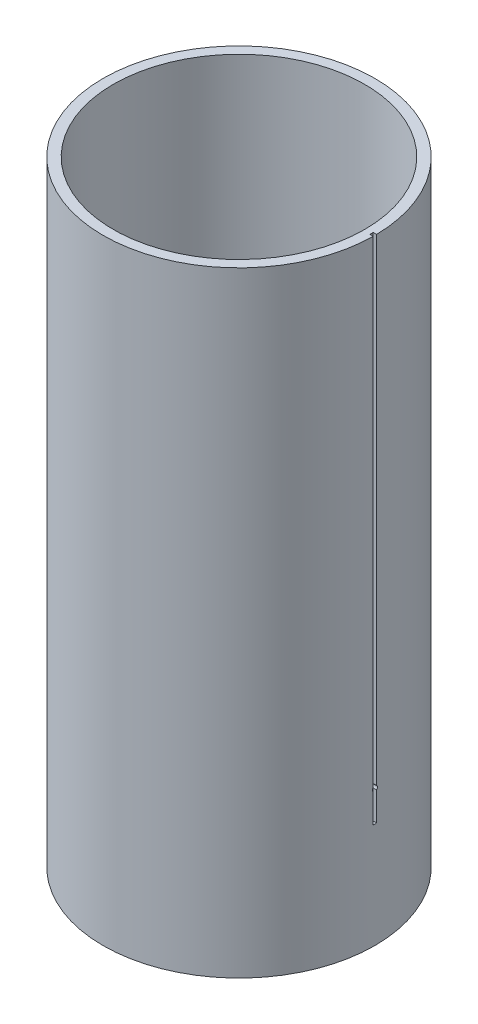
ISO-10303-21;
HEADER;
FILE_DESCRIPTION(('STEP AP214'),'2;1');
FILE_NAME('part.step','',(''),(''),'','','');
FILE_SCHEMA(('AUTOMOTIVE_DESIGN { 1 0 10303 214 1 1 1 1 }'));
ENDSEC;
DATA;
#1=APPLICATION_CONTEXT('core data for automotive mechanical design processes');
#2=APPLICATION_PROTOCOL_DEFINITION('international standard','automotive_design',2000,#1);
#3=PRODUCT_CONTEXT('',#1,'mechanical');
#4=PRODUCT('Part','Part','',(#3));
#5=PRODUCT_RELATED_PRODUCT_CATEGORY('part','',(#4));
#6=PRODUCT_DEFINITION_FORMATION('','',#4);
#7=PRODUCT_DEFINITION_CONTEXT('part definition',#1,'design');
#8=PRODUCT_DEFINITION('design','',#6,#7);
#9=PRODUCT_DEFINITION_SHAPE('','',#8);
#10=(LENGTH_UNIT() NAMED_UNIT(*) SI_UNIT(.MILLI.,.METRE.));
#11=(NAMED_UNIT(*) PLANE_ANGLE_UNIT() SI_UNIT($,.RADIAN.));
#12=(NAMED_UNIT(*) SI_UNIT($,.STERADIAN.) SOLID_ANGLE_UNIT());
#13=UNCERTAINTY_MEASURE_WITH_UNIT(LENGTH_MEASURE(1.E-05),#10,'distance_accuracy_value','');
#14=(GEOMETRIC_REPRESENTATION_CONTEXT(3) GLOBAL_UNCERTAINTY_ASSIGNED_CONTEXT((#13)) GLOBAL_UNIT_ASSIGNED_CONTEXT((#10,
#11,#12)) REPRESENTATION_CONTEXT('',''));
#15=CARTESIAN_POINT('',(0.,0.,0.));
#16=DIRECTION('',(0.,0.,1.));
#17=DIRECTION('',(1.,0.,0.));
#18=AXIS2_PLACEMENT_3D('',#15,#16,#17);
#19=CARTESIAN_POINT('',(38.9999999999999,181.,-0.500000000000012));
#20=DIRECTION('',(-1.,0.,0.));
#21=DIRECTION('',(0.,0.,1.));
#22=AXIS2_PLACEMENT_3D('',#19,#20,#21);
#23=PLANE('',#22);
#24=DIRECTION('',(0.,1.,0.));
#25=VECTOR('',#24,1.);
#26=CARTESIAN_POINT('',(39.,181.,-0.500000000000012));
#27=LINE('',#26,#25);
#28=CARTESIAN_POINT('',(39.,40.559016994375,-0.500000000000011));
#29=VERTEX_POINT('',#28);
#30=CARTESIAN_POINT('',(39.,181.,-0.500000000000012));
#31=VERTEX_POINT('',#30);
#32=EDGE_CURVE('E79',#29,#31,#27,.T.);
#33=ORIENTED_EDGE('',*,*,#32,.T.);
#34=DIRECTION('',(0.,0.,1.));
#35=VECTOR('',#34,1.);
#36=CARTESIAN_POINT('',(38.9999999999999,181.,0.));
#37=LINE('',#36,#35);
#38=CARTESIAN_POINT('',(38.9999999999999,181.,0.499999999999988));
#39=VERTEX_POINT('',#38);
#40=EDGE_CURVE('E132',#39,#31,#37,.F.);
#41=ORIENTED_EDGE('',*,*,#40,.F.);
#42=DIRECTION('',(0.,1.,0.));
#43=VECTOR('',#42,1.);
#44=CARTESIAN_POINT('',(38.9999999999999,181.,0.499999999999988));
#45=LINE('',#44,#43);
#46=CARTESIAN_POINT('',(39.,40.559016994375,0.499999999999988));
#47=VERTEX_POINT('',#46);
#48=EDGE_CURVE('E133',#39,#47,#45,.F.);
#49=ORIENTED_EDGE('',*,*,#48,.T.);
#50=CARTESIAN_POINT('',(39.,40.,0.));
#51=DIRECTION('',(1.,0.,0.));
#52=DIRECTION('',(0.,0.,-1.));
#53=AXIS2_PLACEMENT_3D('',#50,#51,#52);
#54=CIRCLE('',#53,0.75);
#55=EDGE_CURVE('E20',#29,#47,#54,.T.);
#56=ORIENTED_EDGE('',*,*,#55,.F.);
#57=EDGE_LOOP('',(#33,#41,#49,#56));
#58=FACE_BOUND('',#57,.T.);
#59=ADVANCED_FACE('F17',(#58),#23,.F.);
#60=CARTESIAN_POINT('',(38.9999999999999,181.,-0.500000000000012));
#61=DIRECTION('',(-1.,0.,0.));
#62=DIRECTION('',(0.,0.,1.));
#63=AXIS2_PLACEMENT_3D('',#60,#61,#62);
#64=PLANE('',#63);
#65=DIRECTION('',(0.,1.,0.));
#66=VECTOR('',#65,1.);
#67=CARTESIAN_POINT('',(39.,181.,0.499999999999988));
#68=LINE('',#67,#66);
#69=CARTESIAN_POINT('',(39.,39.440983005625,0.499999999999988));
#70=VERTEX_POINT('',#69);
#71=CARTESIAN_POINT('',(39.,31.,0.499999999999988));
#72=VERTEX_POINT('',#71);
#73=EDGE_CURVE('E89',#70,#72,#68,.F.);
#74=ORIENTED_EDGE('',*,*,#73,.T.);
#75=DIRECTION('',(0.,0.,1.));
#76=VECTOR('',#75,1.);
#77=CARTESIAN_POINT('',(39.,31.,0.));
#78=LINE('',#77,#76);
#79=CARTESIAN_POINT('',(39.,31.,-0.500000000000012));
#80=VERTEX_POINT('',#79);
#81=EDGE_CURVE('E91',#80,#72,#78,.T.);
#82=ORIENTED_EDGE('',*,*,#81,.F.);
#83=DIRECTION('',(0.,1.,0.));
#84=VECTOR('',#83,1.);
#85=CARTESIAN_POINT('',(39.,181.,-0.500000000000012));
#86=LINE('',#85,#84);
#87=CARTESIAN_POINT('',(39.,39.4409830056251,-0.500000000000012));
#88=VERTEX_POINT('',#87);
#89=EDGE_CURVE('E118',#80,#88,#86,.T.);
#90=ORIENTED_EDGE('',*,*,#89,.T.);
#91=CARTESIAN_POINT('',(39.,40.,0.));
#92=DIRECTION('',(1.,0.,0.));
#93=DIRECTION('',(0.,0.,-1.));
#94=AXIS2_PLACEMENT_3D('',#91,#92,#93);
#95=CIRCLE('',#94,0.75);
#96=EDGE_CURVE('E94',#88,#70,#95,.F.);
#97=ORIENTED_EDGE('',*,*,#96,.T.);
#98=EDGE_LOOP('',(#74,#82,#90,#97));
#99=FACE_BOUND('',#98,.T.);
#100=ADVANCED_FACE('F90',(#99),#64,.F.);
#101=CARTESIAN_POINT('',(0.,90.5,0.));
#102=DIRECTION('',(0.,-1.,0.));
#103=DIRECTION('',(1.,0.,0.));
#104=AXIS2_PLACEMENT_3D('',#101,#102,#103);
#105=CYLINDRICAL_SURFACE('',#104,37.);
#106=CARTESIAN_POINT('',(0.,0.,0.));
#107=DIRECTION('',(0.,-1.,0.));
#108=DIRECTION('',(1.,0.,0.));
#109=AXIS2_PLACEMENT_3D('',#106,#107,#108);
#110=CIRCLE('',#109,37.);
#111=CARTESIAN_POINT('',(37.,0.,0.));
#112=VERTEX_POINT('',#111);
#113=EDGE_CURVE('E107',#112,#112,#110,.F.);
#114=ORIENTED_EDGE('',*,*,#113,.F.);
#115=EDGE_LOOP('',(#114));
#116=FACE_BOUND('',#115,.T.);
#117=CARTESIAN_POINT('',(36.99239786767,40.,0.75));
#118=CARTESIAN_POINT('',(36.9923979703776,39.9578768140699,0.749998133443684));
#119=CARTESIAN_POINT('',(36.9924705888028,39.9157231949966,0.746439364963934));
#120=CARTESIAN_POINT('',(36.9927532919978,39.8325772080061,0.732292294268633));
#121=CARTESIAN_POINT('',(36.9929635416511,39.7915862945541,0.721695560276461));
#122=CARTESIAN_POINT('',(36.9934976802035,39.7119823072016,0.693774632990046));
#123=CARTESIAN_POINT('',(36.9938215142162,39.6733680954056,0.676453688538889));
#124=CARTESIAN_POINT('',(36.994546261413,39.5996063888738,0.635580571476415));
#125=CARTESIAN_POINT('',(36.994947155584,39.5644580422376,0.612029935373974));
#126=CARTESIAN_POINT('',(36.9957809879328,39.4986048153643,0.559357614178141));
#127=CARTESIAN_POINT('',(36.9962139335548,39.4679009723327,0.530234632346687));
#128=CARTESIAN_POINT('',(36.9970630043643,39.4118169158714,0.46724618952165));
#129=CARTESIAN_POINT('',(36.9974791288864,39.3864369128443,0.433380541182082));
#130=CARTESIAN_POINT('',(36.9982476588202,39.3417207851422,0.361866061335234));
#131=CARTESIAN_POINT('',(36.9986000599341,39.3223850680526,0.324216974924885));
#132=CARTESIAN_POINT('',(36.9992013763344,39.290309125329,0.246206200378215));
#133=CARTESIAN_POINT('',(36.9994502919234,39.2775688804192,0.205844520170134));
#134=CARTESIAN_POINT('',(36.9998165461986,39.2590471715566,0.123560125666501));
#135=CARTESIAN_POINT('',(36.9999339029588,39.2532647517152,0.0816376266173462));
#136=CARTESIAN_POINT('',(37.0000238699803,39.2488198979541,-0.00258319446099518));
#137=CARTESIAN_POINT('',(36.999996480647,39.2501574440922,-0.0448815154372159));
#138=CARTESIAN_POINT('',(36.9998000591075,39.2599137236414,-0.128646795850805));
#139=CARTESIAN_POINT('',(36.9996310476745,39.2683314185248,-0.170113876302631));
#140=CARTESIAN_POINT('',(36.9991704573945,39.2920074455129,-0.251046204426437));
#141=CARTESIAN_POINT('',(36.9988788783542,39.3072657884151,-0.290511448938543));
#142=CARTESIAN_POINT('',(36.9982059854145,39.3441911698019,-0.366323130288698));
#143=CARTESIAN_POINT('',(36.9978246648465,39.3658586845921,-0.402669335072276));
#144=CARTESIAN_POINT('',(36.9970152721113,39.414986979367,-0.471208634047363));
#145=CARTESIAN_POINT('',(36.9965871999056,39.4424477641231,-0.503401724818093));
#146=CARTESIAN_POINT('',(36.995732465833,39.5023889707317,-0.562727012223014));
#147=CARTESIAN_POINT('',(36.9953058042338,39.5348702952342,-0.589858296847963));
#148=CARTESIAN_POINT('',(36.99450207148,39.6039273573199,-0.6382827849312));
#149=CARTESIAN_POINT('',(36.9941250003327,39.6405030954933,-0.659575987547879));
#150=CARTESIAN_POINT('',(36.993462968463,39.7167112168395,-0.695719758675123));
#151=CARTESIAN_POINT('',(36.9931780081406,39.7563436132811,-0.710570299216725));
#152=CARTESIAN_POINT('',(36.9927323444016,39.8375397878188,-0.733406607834691));
#153=CARTESIAN_POINT('',(36.9925716408275,39.8791035634659,-0.741392384615033));
#154=CARTESIAN_POINT('',(36.992392637546,39.9629747077239,-0.750271360209999));
#155=CARTESIAN_POINT('',(36.9923743124949,40.0052819426527,-0.75116582130289));
#156=CARTESIAN_POINT('',(36.9924820662678,40.0894460017049,-0.745840062639382));
#157=CARTESIAN_POINT('',(36.9926081450191,40.1313028260555,-0.739619846469974));
#158=CARTESIAN_POINT('',(36.9929904696356,40.2133743688038,-0.72024234954561));
#159=CARTESIAN_POINT('',(36.9932467047637,40.2535892223595,-0.70708564100959));
#160=CARTESIAN_POINT('',(36.99386044585,40.3312393970862,-0.674209217403048));
#161=CARTESIAN_POINT('',(36.9942179518942,40.3686747158967,-0.65448949675908));
#162=CARTESIAN_POINT('',(36.9949939927155,40.4397089708289,-0.60904357169286));
#163=CARTESIAN_POINT('',(36.9954125361301,40.4733073627789,-0.583316516852368));
#164=CARTESIAN_POINT('',(36.9962634357748,40.5357085587487,-0.526587474537818));
#165=CARTESIAN_POINT('',(36.996695792024,40.5645113561304,-0.495585479762336));
#166=CARTESIAN_POINT('',(36.9975256484875,40.6165079443379,-0.429181199977825));
#167=CARTESIAN_POINT('',(36.9979231436348,40.6397009206574,-0.393778277113606));
#168=CARTESIAN_POINT('',(36.9986383940448,40.6798139140458,-0.319580399148472));
#169=CARTESIAN_POINT('',(36.9989561494354,40.6967339411732,-0.280785449486676));
#170=CARTESIAN_POINT('',(36.9994760742668,40.7238193192323,-0.200907849576696));
#171=CARTESIAN_POINT('',(36.9996782527837,40.7339852005592,-0.159825379239488));
#172=CARTESIAN_POINT('',(36.999944267466,40.7472754582642,-0.0765363364043515));
#173=CARTESIAN_POINT('',(37.0000081035513,40.7503998305589,-0.0343297632545882));
#174=CARTESIAN_POINT('',(36.9999902370405,40.7495183030754,0.0500011528485013));
#175=CARTESIAN_POINT('',(36.9999085607766,40.7455136933724,0.0921255092989919));
#176=CARTESIAN_POINT('',(36.9996089270393,40.7304905171578,0.175103924890476));
#177=CARTESIAN_POINT('',(36.9993909692936,40.7194719366287,0.215957981492565));
#178=CARTESIAN_POINT('',(36.9988433322783,40.6907336335955,0.295236941907183));
#179=CARTESIAN_POINT('',(36.9985136509928,40.6730137901736,0.333661801872598));
#180=CARTESIAN_POINT('',(36.997779735014,40.6313768212529,0.406990027819813));
#181=CARTESIAN_POINT('',(36.9973755031426,40.6074599303073,0.441893527012837));
#182=CARTESIAN_POINT('',(36.9965379924104,40.5541055594883,0.507193198708242));
#183=CARTESIAN_POINT('',(36.996104711386,40.5246676681204,0.53758903494028));
#184=CARTESIAN_POINT('',(36.9952578538298,40.4610981539002,0.593015115105851));
#185=CARTESIAN_POINT('',(36.9948442822137,40.4269653682518,0.618044025857709));
#186=CARTESIAN_POINT('',(36.9940833768069,40.3549656589253,0.66202779641476));
#187=CARTESIAN_POINT('',(36.9937360799185,40.3170966726063,0.680979276243378));
#188=CARTESIAN_POINT('',(36.9931476091923,40.2387432541929,0.712233551338459));
#189=CARTESIAN_POINT('',(36.992906308504,40.1982620152408,0.724544297922071));
#190=CARTESIAN_POINT('',(36.9926217283157,40.1312698499702,0.738895059347733));
#191=CARTESIAN_POINT('',(36.9925381436154,40.1051940142961,0.743054195439273));
#192=CARTESIAN_POINT('',(36.9924261811346,40.0527494312173,0.748607250070175));
#193=CARTESIAN_POINT('',(36.9923978033469,40.0263806838516,0.750001168976918));
#194=CARTESIAN_POINT('',(36.99239786767,40.,0.75));
#195=B_SPLINE_CURVE_WITH_KNOTS('',3,(#117,#118,#119,#120,#121,#122,#123,#124,#125,#126,#127,
#128,#129,#130,#131,#132,#133,#134,#135,#136,#137,#138,#139,#140,#141,#142,#143,#144,#145,#146,
#147,#148,#149,#150,#151,#152,#153,#154,#155,#156,#157,#158,#159,#160,#161,#162,#163,#164,#165,
#166,#167,#168,#169,#170,#171,#172,#173,#174,#175,#176,#177,#178,#179,#180,#181,#182,#183,#184,
#185,#186,#187,#188,#189,#190,#191,#192,#193,#194),.UNSPECIFIED.,.T.,.F.,(4,2,2,2,2,2,2,2,2,2,2,
2,2,2,2,2,2,2,2,2,2,2,2,2,2,2,2,2,2,2,2,2,2,2,2,2,2,2,4),(0.,0.126273266765285,
0.252698087722692,0.379061901630251,0.505394577820253,0.631756688664638,0.758123792505042,
0.884499415841514,1.01087466982938,1.1372325599912,1.26359009623912,1.38992910138837,
1.51626830595601,1.64261690194157,1.76896560199548,1.89533704494593,2.02170850611388,
2.14808051588166,2.27445236541946,2.40080171983386,2.52715101054701,2.65348987983349,
2.77982885640983,2.90618572880709,3.03254277610541,3.1589181585535,3.28529333836223,
3.41165859290322,3.53802392072143,3.66436638353381,3.79070909884635,3.9170540940001,
4.04339430779561,4.16974394179822,4.29612492566352,4.42257607518237,4.54887547976363,
4.62795723719612,4.70703898412199),.UNSPECIFIED.);
#196=CARTESIAN_POINT('',(36.99239786767,40.,0.75));
#197=VERTEX_POINT('',#196);
#198=EDGE_CURVE('E121',#197,#197,#195,.T.);
#199=ORIENTED_EDGE('',*,*,#198,.T.);
#200=EDGE_LOOP('',(#199));
#201=FACE_BOUND('',#200,.T.);
#202=CARTESIAN_POINT('',(0.,181.,0.));
#203=DIRECTION('',(0.,-1.,0.));
#204=DIRECTION('',(1.,0.,0.));
#205=AXIS2_PLACEMENT_3D('',#202,#203,#204);
#206=CIRCLE('',#205,37.);
#207=CARTESIAN_POINT('',(36.9999999999999,181.,0.));
#208=VERTEX_POINT('',#207);
#209=EDGE_CURVE('E144',#208,#208,#206,.T.);
#210=ORIENTED_EDGE('',*,*,#209,.F.);
#211=EDGE_LOOP('',(#210));
#212=FACE_BOUND('',#211,.T.);
#213=ADVANCED_FACE('F193',(#116,#201,#212),#105,.F.);
#214=CARTESIAN_POINT('',(38.9999999999999,181.,0.499999999999988));
#215=DIRECTION('',(0.,0.,1.));
#216=DIRECTION('',(1.,0.,0.));
#217=AXIS2_PLACEMENT_3D('',#214,#215,#216);
#218=PLANE('',#217);
#219=ORIENTED_EDGE('',*,*,#48,.F.);
#220=DIRECTION('',(1.,0.,0.));
#221=VECTOR('',#220,1.);
#222=CARTESIAN_POINT('',(38.4999999999999,181.,0.499999999999988));
#223=LINE('',#222,#221);
#224=CARTESIAN_POINT('',(39.9968748779201,181.,0.499999999999988));
#225=VERTEX_POINT('',#224);
#226=EDGE_CURVE('E129',#225,#39,#223,.F.);
#227=ORIENTED_EDGE('',*,*,#226,.F.);
#228=DIRECTION('',(0.,-1.,0.));
#229=VECTOR('',#228,1.);
#230=CARTESIAN_POINT('',(39.9968748779201,90.5,0.499999999999988));
#231=LINE('',#230,#229);
#232=CARTESIAN_POINT('',(39.9968748779201,40.559016994375,0.499999999999987));
#233=VERTEX_POINT('',#232);
#234=EDGE_CURVE('E185',#233,#225,#231,.F.);
#235=ORIENTED_EDGE('',*,*,#234,.F.);
#236=DIRECTION('',(1.,0.,0.));
#237=VECTOR('',#236,1.);
#238=CARTESIAN_POINT('',(213.450228390602,40.559016994375,0.499999999999987));
#239=LINE('',#238,#237);
#240=EDGE_CURVE('E122',#233,#47,#239,.F.);
#241=ORIENTED_EDGE('',*,*,#240,.T.);
#242=EDGE_LOOP('',(#219,#227,#235,#241));
#243=FACE_BOUND('',#242,.T.);
#244=ADVANCED_FACE('F197',(#243),#218,.F.);
#245=CARTESIAN_POINT('',(38.4999999999999,181.,0.));
#246=DIRECTION('',(0.,1.,0.));
#247=DIRECTION('',(0.,0.,1.));
#248=AXIS2_PLACEMENT_3D('',#245,#246,#247);
#249=PLANE('',#248);
#250=ORIENTED_EDGE('',*,*,#209,.T.);
#251=EDGE_LOOP('',(#250));
#252=FACE_BOUND('',#251,.T.);
#253=DIRECTION('',(-1.,0.,0.));
#254=VECTOR('',#253,1.);
#255=CARTESIAN_POINT('',(39.9968748779201,181.,-0.500000000000012));
#256=LINE('',#255,#254);
#257=CARTESIAN_POINT('',(39.9968748779201,181.,-0.500000000000012));
#258=VERTEX_POINT('',#257);
#259=EDGE_CURVE('E125',#31,#258,#256,.F.);
#260=ORIENTED_EDGE('',*,*,#259,.T.);
#261=CARTESIAN_POINT('',(0.,181.,0.));
#262=DIRECTION('',(0.,-1.,0.));
#263=DIRECTION('',(1.,0.,0.));
#264=AXIS2_PLACEMENT_3D('',#261,#262,#263);
#265=CIRCLE('',#264,40.);
#266=EDGE_CURVE('E165',#225,#258,#265,.T.);
#267=ORIENTED_EDGE('',*,*,#266,.F.);
#268=ORIENTED_EDGE('',*,*,#226,.T.);
#269=ORIENTED_EDGE('',*,*,#40,.T.);
#270=EDGE_LOOP('',(#260,#267,#268,#269));
#271=FACE_BOUND('',#270,.T.);
#272=ADVANCED_FACE('F225',(#252,#271),#249,.T.);
#273=CARTESIAN_POINT('',(39.9968748779201,181.,-0.500000000000012));
#274=DIRECTION('',(0.,0.,-1.));
#275=DIRECTION('',(-1.,0.,0.));
#276=AXIS2_PLACEMENT_3D('',#273,#274,#275);
#277=PLANE('',#276);
#278=DIRECTION('',(0.,-1.,0.));
#279=VECTOR('',#278,1.);
#280=CARTESIAN_POINT('',(39.9968748779201,90.5,-0.500000000000012));
#281=LINE('',#280,#279);
#282=CARTESIAN_POINT('',(39.9968748779201,40.5590169943749,-0.500000000000012));
#283=VERTEX_POINT('',#282);
#284=EDGE_CURVE('E164',#258,#283,#281,.T.);
#285=ORIENTED_EDGE('',*,*,#284,.F.);
#286=ORIENTED_EDGE('',*,*,#259,.F.);
#287=ORIENTED_EDGE('',*,*,#32,.F.);
#288=DIRECTION('',(1.,0.,0.));
#289=VECTOR('',#288,1.);
#290=CARTESIAN_POINT('',(213.450228390602,40.5590169943749,-0.500000000000008));
#291=LINE('',#290,#289);
#292=EDGE_CURVE('E119',#29,#283,#291,.T.);
#293=ORIENTED_EDGE('',*,*,#292,.T.);
#294=EDGE_LOOP('',(#285,#286,#287,#293));
#295=FACE_BOUND('',#294,.T.);
#296=ADVANCED_FACE('F232',(#295),#277,.F.);
#297=CARTESIAN_POINT('',(213.450228390602,40.,0.));
#298=DIRECTION('',(1.,0.,0.));
#299=DIRECTION('',(0.,0.,-1.));
#300=AXIS2_PLACEMENT_3D('',#297,#298,#299);
#301=CYLINDRICAL_SURFACE('',#300,0.75);
#302=ORIENTED_EDGE('',*,*,#198,.F.);
#303=EDGE_LOOP('',(#302));
#304=FACE_BOUND('',#303,.T.);
#305=CARTESIAN_POINT('',(39.9968748779201,40.5590169943749,-0.500000000000016));
#306=CARTESIAN_POINT('',(39.9964812005178,40.5309142316828,-0.531473529080754));
#307=CARTESIAN_POINT('',(39.9960810877867,40.500112867661,-0.56051897816624));
#308=CARTESIAN_POINT('',(39.9953108201805,40.434113687649,-0.613031518626442));
#309=CARTESIAN_POINT('',(39.9949406409503,40.3989195063539,-0.636503175785333));
#310=CARTESIAN_POINT('',(39.9942721225956,40.3250684319706,-0.677209680673498));
#311=CARTESIAN_POINT('',(39.9939738178191,40.2864098953588,-0.694441548437051));
#312=CARTESIAN_POINT('',(39.9934827647086,40.206753874576,-0.722170429589762));
#313=CARTESIAN_POINT('',(39.9932900035413,40.1657566754374,-0.732668261810819));
#314=CARTESIAN_POINT('',(39.9930317811162,40.0825830894534,-0.746631356642218));
#315=CARTESIAN_POINT('',(39.9929663135996,40.0404067606864,-0.75009696501018));
#316=CARTESIAN_POINT('',(39.992970027795,39.956070556311,-0.74989889855223));
#317=CARTESIAN_POINT('',(39.9930392103293,39.9139106808047,-0.746235180193112));
#318=CARTESIAN_POINT('',(39.9933044160464,39.8308115948822,-0.731882975965883));
#319=CARTESIAN_POINT('',(39.9935004198084,39.7898721985706,-0.721195565674521));
#320=CARTESIAN_POINT('',(39.9939971345881,39.710362879537,-0.693101087444809));
#321=CARTESIAN_POINT('',(39.9942978555964,39.6717931833098,-0.675693378337904));
#322=CARTESIAN_POINT('',(39.9949655785656,39.5986418329402,-0.63493066146235));
#323=CARTESIAN_POINT('',(39.9953316032778,39.5640122814334,-0.611661498484757));
#324=CARTESIAN_POINT('',(39.9960921325197,39.4990399268343,-0.559717541527218));
#325=CARTESIAN_POINT('',(39.99648665672,39.4687001281199,-0.531038991510006));
#326=CARTESIAN_POINT('',(39.9968748779201,39.4409830056251,-0.500000000000006));
#327=B_SPLINE_CURVE_WITH_KNOTS('',3,(#305,#306,#307,#308,#309,#310,#311,#312,#313,#314,#315,
#316,#317,#318,#319,#320,#321,#322,#323,#324,#325,#326),.UNSPECIFIED.,.F.,.F.,(4,2,2,2,2,2,2,2,
2,2,4),(0.,0.126419915365715,0.252735913568299,0.379112157784646,0.505473032238695,
0.631827693680355,0.758183126673246,0.884519214667908,1.01086735908382,1.13546291881355,
1.26014531276324),.UNSPECIFIED.);
#328=CARTESIAN_POINT('',(39.9968748779201,39.4409830056251,-0.500000000000012));
#329=VERTEX_POINT('',#328);
#330=EDGE_CURVE('E156',#283,#329,#327,.T.);
#331=ORIENTED_EDGE('',*,*,#330,.F.);
#332=ORIENTED_EDGE('',*,*,#292,.F.);
#333=ORIENTED_EDGE('',*,*,#55,.T.);
#334=ORIENTED_EDGE('',*,*,#240,.F.);
#335=CARTESIAN_POINT('',(39.9968748779201,39.440983005625,0.499999999999987));
#336=CARTESIAN_POINT('',(39.9964812005178,39.4690857683172,0.531473529080729));
#337=CARTESIAN_POINT('',(39.9960810877867,39.4998871323389,0.560518978166216));
#338=CARTESIAN_POINT('',(39.9953108201805,39.565886312351,0.613031518626421));
#339=CARTESIAN_POINT('',(39.9949406409503,39.6010804936461,0.636503175785312));
#340=CARTESIAN_POINT('',(39.9942721225956,39.6749315680294,0.677209680673479));
#341=CARTESIAN_POINT('',(39.9939738178191,39.7135901046411,0.694441548437035));
#342=CARTESIAN_POINT('',(39.9934827647086,39.7932461254239,0.722170429589751));
#343=CARTESIAN_POINT('',(39.9932900035413,39.8342433245626,0.732668261810811));
#344=CARTESIAN_POINT('',(39.9930317811162,39.9174169105465,0.746631356642214));
#345=CARTESIAN_POINT('',(39.9929663135996,39.9595932393136,0.750096965010178));
#346=CARTESIAN_POINT('',(39.992970027795,40.043929443689,0.749898898552233));
#347=CARTESIAN_POINT('',(39.9930392103293,40.0860893191953,0.746235180193116));
#348=CARTESIAN_POINT('',(39.9933044160464,40.1691884051178,0.731882975965892));
#349=CARTESIAN_POINT('',(39.9935004198084,40.2101278014294,0.721195565674534));
#350=CARTESIAN_POINT('',(39.9939971345881,40.289637120463,0.693101087444826));
#351=CARTESIAN_POINT('',(39.9942978555964,40.3282068166902,0.675693378337922));
#352=CARTESIAN_POINT('',(39.9949655785656,40.4013581670598,0.634930661462365));
#353=CARTESIAN_POINT('',(39.9953316032778,40.4359877185666,0.611661498484766));
#354=CARTESIAN_POINT('',(39.9960921325197,40.5009600731657,0.559717541527214));
#355=CARTESIAN_POINT('',(39.99648665672,40.5312998718801,0.531038991509995));
#356=CARTESIAN_POINT('',(39.9968748779201,40.559016994375,0.49999999999999));
#357=B_SPLINE_CURVE_WITH_KNOTS('',3,(#335,#336,#337,#338,#339,#340,#341,#342,#343,#344,#345,
#346,#347,#348,#349,#350,#351,#352,#353,#354,#355,#356),.UNSPECIFIED.,.F.,.F.,(4,2,2,2,2,2,2,2,
2,2,4),(0.,0.126419915365714,0.2527359135683,0.379112157784642,0.505473032238701,
0.631827693680354,0.758183126673245,0.884519214667911,1.01086735908382,1.13546291881359,
1.26014531276331),.UNSPECIFIED.);
#358=CARTESIAN_POINT('',(39.9968748779201,39.440983005625,0.499999999999988));
#359=VERTEX_POINT('',#358);
#360=EDGE_CURVE('E179',#359,#233,#357,.T.);
#361=ORIENTED_EDGE('',*,*,#360,.F.);
#362=DIRECTION('',(1.,0.,0.));
#363=VECTOR('',#362,1.);
#364=CARTESIAN_POINT('',(38.9999999999999,39.440983005625,0.499999999999988));
#365=LINE('',#364,#363);
#366=EDGE_CURVE('E105',#359,#70,#365,.F.);
#367=ORIENTED_EDGE('',*,*,#366,.T.);
#368=ORIENTED_EDGE('',*,*,#96,.F.);
#369=DIRECTION('',(-1.,0.,0.));
#370=VECTOR('',#369,1.);
#371=CARTESIAN_POINT('',(39.9968748779201,39.4409830056251,-0.500000000000012));
#372=LINE('',#371,#370);
#373=EDGE_CURVE('E114',#88,#329,#372,.F.);
#374=ORIENTED_EDGE('',*,*,#373,.T.);
#375=EDGE_LOOP('',(#331,#332,#333,#334,#361,#367,#368,#374));
#376=FACE_BOUND('',#375,.T.);
#377=ADVANCED_FACE('F167',(#304,#376),#301,.F.);
#378=CARTESIAN_POINT('',(39.9968748779201,181.,-0.500000000000012));
#379=DIRECTION('',(0.,0.,-1.));
#380=DIRECTION('',(-1.,0.,0.));
#381=AXIS2_PLACEMENT_3D('',#378,#379,#380);
#382=PLANE('',#381);
#383=ORIENTED_EDGE('',*,*,#89,.F.);
#384=DIRECTION('',(1.,0.,0.));
#385=VECTOR('',#384,1.);
#386=CARTESIAN_POINT('',(39.4989101992107,31.,-0.500000000000012));
#387=LINE('',#386,#385);
#388=CARTESIAN_POINT('',(39.9968748779201,31.,-0.500000000000012));
#389=VERTEX_POINT('',#388);
#390=EDGE_CURVE('E100',#389,#80,#387,.F.);
#391=ORIENTED_EDGE('',*,*,#390,.F.);
#392=DIRECTION('',(0.,-1.,0.));
#393=VECTOR('',#392,1.);
#394=CARTESIAN_POINT('',(39.9968748779201,90.5,-0.500000000000012));
#395=LINE('',#394,#393);
#396=EDGE_CURVE('E155',#329,#389,#395,.T.);
#397=ORIENTED_EDGE('',*,*,#396,.F.);
#398=ORIENTED_EDGE('',*,*,#373,.F.);
#399=EDGE_LOOP('',(#383,#391,#397,#398));
#400=FACE_BOUND('',#399,.T.);
#401=ADVANCED_FACE('F245',(#400),#382,.F.);
#402=CARTESIAN_POINT('',(39.4989101992107,31.,0.));
#403=DIRECTION('',(0.,1.,0.));
#404=DIRECTION('',(0.,0.,1.));
#405=AXIS2_PLACEMENT_3D('',#402,#403,#404);
#406=PLANE('',#405);
#407=ORIENTED_EDGE('',*,*,#390,.T.);
#408=ORIENTED_EDGE('',*,*,#81,.T.);
#409=DIRECTION('',(1.,0.,0.));
#410=VECTOR('',#409,1.);
#411=CARTESIAN_POINT('',(38.9999999999999,31.,0.499999999999988));
#412=LINE('',#411,#410);
#413=CARTESIAN_POINT('',(39.9968748779201,31.,0.499999999999988));
#414=VERTEX_POINT('',#413);
#415=EDGE_CURVE('E35',#72,#414,#412,.T.);
#416=ORIENTED_EDGE('',*,*,#415,.T.);
#417=CARTESIAN_POINT('',(0.,31.,0.));
#418=DIRECTION('',(0.,-1.,0.));
#419=DIRECTION('',(1.,0.,0.));
#420=AXIS2_PLACEMENT_3D('',#417,#418,#419);
#421=CIRCLE('',#420,40.);
#422=EDGE_CURVE('E153',#389,#414,#421,.T.);
#423=ORIENTED_EDGE('',*,*,#422,.F.);
#424=EDGE_LOOP('',(#407,#408,#416,#423));
#425=FACE_BOUND('',#424,.T.);
#426=ADVANCED_FACE('F99',(#425),#406,.T.);
#427=CARTESIAN_POINT('',(38.9999999999999,181.,0.499999999999988));
#428=DIRECTION('',(0.,0.,1.));
#429=DIRECTION('',(1.,0.,0.));
#430=AXIS2_PLACEMENT_3D('',#427,#428,#429);
#431=PLANE('',#430);
#432=DIRECTION('',(0.,-1.,0.));
#433=VECTOR('',#432,1.);
#434=CARTESIAN_POINT('',(39.9968748779201,90.5,0.499999999999988));
#435=LINE('',#434,#433);
#436=EDGE_CURVE('E26',#414,#359,#435,.F.);
#437=ORIENTED_EDGE('',*,*,#436,.F.);
#438=ORIENTED_EDGE('',*,*,#415,.F.);
#439=ORIENTED_EDGE('',*,*,#73,.F.);
#440=ORIENTED_EDGE('',*,*,#366,.F.);
#441=EDGE_LOOP('',(#437,#438,#439,#440));
#442=FACE_BOUND('',#441,.T.);
#443=ADVANCED_FACE('F102',(#442),#431,.F.);
#444=CARTESIAN_POINT('',(38.5,0.,0.));
#445=DIRECTION('',(0.,-1.,0.));
#446=DIRECTION('',(0.,0.,-1.));
#447=AXIS2_PLACEMENT_3D('',#444,#445,#446);
#448=PLANE('',#447);
#449=ORIENTED_EDGE('',*,*,#113,.T.);
#450=EDGE_LOOP('',(#449));
#451=FACE_BOUND('',#450,.T.);
#452=CARTESIAN_POINT('',(0.,0.,0.));
#453=DIRECTION('',(0.,-1.,0.));
#454=DIRECTION('',(1.,0.,0.));
#455=AXIS2_PLACEMENT_3D('',#452,#453,#454);
#456=CIRCLE('',#455,40.);
#457=CARTESIAN_POINT('',(40.,0.,0.));
#458=VERTEX_POINT('',#457);
#459=EDGE_CURVE('E11',#458,#458,#456,.F.);
#460=ORIENTED_EDGE('',*,*,#459,.F.);
#461=EDGE_LOOP('',(#460));
#462=FACE_BOUND('',#461,.T.);
#463=ADVANCED_FACE('F175',(#451,#462),#448,.T.);
#464=CARTESIAN_POINT('',(0.,90.5,0.));
#465=DIRECTION('',(0.,-1.,0.));
#466=DIRECTION('',(1.,0.,0.));
#467=AXIS2_PLACEMENT_3D('',#464,#465,#466);
#468=CYLINDRICAL_SURFACE('',#467,40.);
#469=ORIENTED_EDGE('',*,*,#459,.T.);
#470=EDGE_LOOP('',(#469));
#471=FACE_BOUND('',#470,.T.);
#472=ORIENTED_EDGE('',*,*,#422,.T.);
#473=ORIENTED_EDGE('',*,*,#436,.T.);
#474=ORIENTED_EDGE('',*,*,#360,.T.);
#475=ORIENTED_EDGE('',*,*,#234,.T.);
#476=ORIENTED_EDGE('',*,*,#266,.T.);
#477=ORIENTED_EDGE('',*,*,#284,.T.);
#478=ORIENTED_EDGE('',*,*,#330,.T.);
#479=ORIENTED_EDGE('',*,*,#396,.T.);
#480=EDGE_LOOP('',(#472,#473,#474,#475,#476,#477,#478,#479));
#481=FACE_BOUND('',#480,.T.);
#482=ADVANCED_FACE('F171',(#471,#481),#468,.T.);
#483=CLOSED_SHELL('',(#59,#100,#213,#244,#272,#296,#377,#401,#426,#443,#463,#482));
#484=MANIFOLD_SOLID_BREP('B1',#483);
#485=ADVANCED_BREP_SHAPE_REPRESENTATION('',(#18,#484),#14);
#486=SHAPE_DEFINITION_REPRESENTATION(#9,#485);
ENDSEC;
END-ISO-10303-21;
